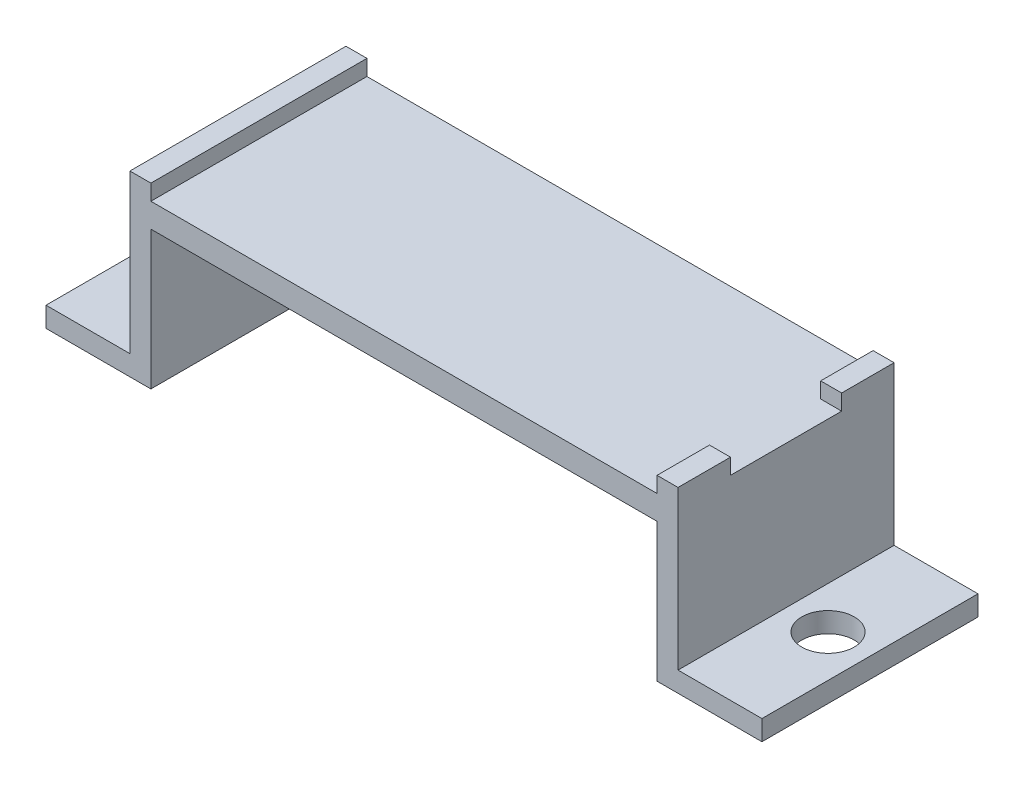
ISO-10303-21;
HEADER;
FILE_DESCRIPTION(('STEP AP214'),'2;1');
FILE_NAME('part.step','',(''),(''),'','','');
FILE_SCHEMA(('AUTOMOTIVE_DESIGN { 1 0 10303 214 1 1 1 1 }'));
ENDSEC;
DATA;
#1=APPLICATION_CONTEXT('core data for automotive mechanical design processes');
#2=APPLICATION_PROTOCOL_DEFINITION('international standard','automotive_design',2000,#1);
#3=PRODUCT_CONTEXT('',#1,'mechanical');
#4=PRODUCT('Part','Part','',(#3));
#5=PRODUCT_RELATED_PRODUCT_CATEGORY('part','',(#4));
#6=PRODUCT_DEFINITION_FORMATION('','',#4);
#7=PRODUCT_DEFINITION_CONTEXT('part definition',#1,'design');
#8=PRODUCT_DEFINITION('design','',#6,#7);
#9=PRODUCT_DEFINITION_SHAPE('','',#8);
#10=(LENGTH_UNIT() NAMED_UNIT(*) SI_UNIT(.MILLI.,.METRE.));
#11=(NAMED_UNIT(*) PLANE_ANGLE_UNIT() SI_UNIT($,.RADIAN.));
#12=(NAMED_UNIT(*) SI_UNIT($,.STERADIAN.) SOLID_ANGLE_UNIT());
#13=UNCERTAINTY_MEASURE_WITH_UNIT(LENGTH_MEASURE(1.E-05),#10,'distance_accuracy_value','');
#14=(GEOMETRIC_REPRESENTATION_CONTEXT(3) GLOBAL_UNCERTAINTY_ASSIGNED_CONTEXT((#13)) GLOBAL_UNIT_ASSIGNED_CONTEXT((#10,
#11,#12)) REPRESENTATION_CONTEXT('',''));
#15=CARTESIAN_POINT('',(0.,0.,0.));
#16=DIRECTION('',(0.,0.,1.));
#17=DIRECTION('',(1.,0.,0.));
#18=AXIS2_PLACEMENT_3D('',#15,#16,#17);
#19=CARTESIAN_POINT('',(35.3009167741011,-9.98205128205126,20.6));
#20=DIRECTION('',(0.,1.,0.));
#21=DIRECTION('',(-1.,0.,0.));
#22=AXIS2_PLACEMENT_3D('',#19,#20,#21);
#23=PLANE('',#22);
#24=CARTESIAN_POINT('',(-28.9590832258989,-9.98205128205127,10.3));
#25=DIRECTION('',(0.,1.,0.));
#26=DIRECTION('',(-1.,0.,0.));
#27=AXIS2_PLACEMENT_3D('',#24,#25,#26);
#28=CIRCLE('',#27,2.5);
#29=CARTESIAN_POINT('',(-31.4590832258989,-9.98205128205127,10.3));
#30=VERTEX_POINT('',#29);
#31=EDGE_CURVE('E211',#30,#30,#28,.T.);
#32=ORIENTED_EDGE('',*,*,#31,.T.);
#33=EDGE_LOOP('',(#32));
#34=FACE_BOUND('',#33,.T.);
#35=DIRECTION('',(1.,0.,0.));
#36=VECTOR('',#35,1.);
#37=CARTESIAN_POINT('',(35.3009167741011,-9.98205128205126,0.));
#38=LINE('',#37,#36);
#39=CARTESIAN_POINT('',(-32.9590832258989,-9.98205128205127,0.));
#40=VERTEX_POINT('',#39);
#41=CARTESIAN_POINT('',(-22.9590832258989,-9.98205128205128,0.));
#42=VERTEX_POINT('',#41);
#43=EDGE_CURVE('E351',#40,#42,#38,.T.);
#44=ORIENTED_EDGE('',*,*,#43,.T.);
#45=DIRECTION('',(0.,0.,1.));
#46=VECTOR('',#45,1.);
#47=CARTESIAN_POINT('',(-22.9590832258989,-9.98205128205128,-4.8));
#48=LINE('',#47,#46);
#49=CARTESIAN_POINT('',(-22.9590832258989,-9.98205128205128,20.6));
#50=VERTEX_POINT('',#49);
#51=EDGE_CURVE('E295',#42,#50,#48,.T.);
#52=ORIENTED_EDGE('',*,*,#51,.T.);
#53=DIRECTION('',(1.,0.,0.));
#54=VECTOR('',#53,1.);
#55=CARTESIAN_POINT('',(35.3009167741011,-9.98205128205126,20.6));
#56=LINE('',#55,#54);
#57=CARTESIAN_POINT('',(-32.9590832258989,-9.98205128205127,20.6));
#58=VERTEX_POINT('',#57);
#59=EDGE_CURVE('E326',#58,#50,#56,.T.);
#60=ORIENTED_EDGE('',*,*,#59,.F.);
#61=DIRECTION('',(0.,0.,-1.));
#62=VECTOR('',#61,1.);
#63=CARTESIAN_POINT('',(-32.9590832258989,-9.98205128205127,20.6));
#64=LINE('',#63,#62);
#65=EDGE_CURVE('E371',#58,#40,#64,.T.);
#66=ORIENTED_EDGE('',*,*,#65,.T.);
#67=EDGE_LOOP('',(#44,#52,#60,#66));
#68=FACE_BOUND('',#67,.T.);
#69=ADVANCED_FACE('F39',(#34,#68),#23,.F.);
#70=CARTESIAN_POINT('',(27.3009167741011,5.51794871794872,20.6));
#71=DIRECTION('',(-1.,0.,0.));
#72=DIRECTION('',(0.,-1.,0.));
#73=AXIS2_PLACEMENT_3D('',#70,#71,#72);
#74=PLANE('',#73);
#75=DIRECTION('',(0.,1.,0.));
#76=VECTOR('',#75,1.);
#77=CARTESIAN_POINT('',(27.3009167741011,5.51794871794872,0.));
#78=LINE('',#77,#76);
#79=CARTESIAN_POINT('',(27.3009167741011,-8.06410256410255,0.));
#80=VERTEX_POINT('',#79);
#81=CARTESIAN_POINT('',(27.3009167741011,7.01794871794873,0.));
#82=VERTEX_POINT('',#81);
#83=EDGE_CURVE('E299',#80,#82,#78,.T.);
#84=ORIENTED_EDGE('',*,*,#83,.T.);
#85=DIRECTION('',(0.,0.,1.));
#86=VECTOR('',#85,1.);
#87=CARTESIAN_POINT('',(27.3009167741011,7.01794871794873,0.));
#88=LINE('',#87,#86);
#89=CARTESIAN_POINT('',(27.3009167741011,7.01794871794873,5.));
#90=VERTEX_POINT('',#89);
#91=EDGE_CURVE('E183',#82,#90,#88,.T.);
#92=ORIENTED_EDGE('',*,*,#91,.T.);
#93=DIRECTION('',(0.,-1.,0.));
#94=VECTOR('',#93,1.);
#95=CARTESIAN_POINT('',(27.3009167741011,5.51794871794872,5.));
#96=LINE('',#95,#94);
#97=CARTESIAN_POINT('',(27.3009167741011,5.51794871794872,5.));
#98=VERTEX_POINT('',#97);
#99=EDGE_CURVE('E205',#90,#98,#96,.T.);
#100=ORIENTED_EDGE('',*,*,#99,.T.);
#101=DIRECTION('',(0.,0.,-1.));
#102=VECTOR('',#101,1.);
#103=CARTESIAN_POINT('',(27.3009167741011,5.51794871794872,20.6));
#104=LINE('',#103,#102);
#105=CARTESIAN_POINT('',(27.3009167741011,5.51794871794872,15.6));
#106=VERTEX_POINT('',#105);
#107=EDGE_CURVE('E60',#106,#98,#104,.T.);
#108=ORIENTED_EDGE('',*,*,#107,.F.);
#109=DIRECTION('',(0.,1.,0.));
#110=VECTOR('',#109,1.);
#111=CARTESIAN_POINT('',(27.3009167741011,5.51794871794872,15.6));
#112=LINE('',#111,#110);
#113=CARTESIAN_POINT('',(27.3009167741011,7.01794871794873,15.6));
#114=VERTEX_POINT('',#113);
#115=EDGE_CURVE('E222',#106,#114,#112,.T.);
#116=ORIENTED_EDGE('',*,*,#115,.T.);
#117=DIRECTION('',(0.,0.,1.));
#118=VECTOR('',#117,1.);
#119=CARTESIAN_POINT('',(27.3009167741011,7.01794871794873,20.6));
#120=LINE('',#119,#118);
#121=CARTESIAN_POINT('',(27.3009167741011,7.01794871794873,20.6));
#122=VERTEX_POINT('',#121);
#123=EDGE_CURVE('E229',#114,#122,#120,.T.);
#124=ORIENTED_EDGE('',*,*,#123,.T.);
#125=DIRECTION('',(0.,1.,0.));
#126=VECTOR('',#125,1.);
#127=CARTESIAN_POINT('',(27.3009167741011,5.51794871794872,20.6));
#128=LINE('',#127,#126);
#129=CARTESIAN_POINT('',(27.3009167741011,-8.06410256410255,20.6));
#130=VERTEX_POINT('',#129);
#131=EDGE_CURVE('E309',#130,#122,#128,.T.);
#132=ORIENTED_EDGE('',*,*,#131,.F.);
#133=DIRECTION('',(0.,0.,-1.));
#134=VECTOR('',#133,1.);
#135=CARTESIAN_POINT('',(27.3009167741011,-8.06410256410255,20.6));
#136=LINE('',#135,#134);
#137=EDGE_CURVE('E336',#130,#80,#136,.T.);
#138=ORIENTED_EDGE('',*,*,#137,.T.);
#139=EDGE_LOOP('',(#84,#92,#100,#108,#116,#124,#132,#138));
#140=FACE_BOUND('',#139,.T.);
#141=ADVANCED_FACE('F41',(#140),#74,.F.);
#142=CARTESIAN_POINT('',(-24.9590832258989,5.51794871794872,20.6));
#143=DIRECTION('',(0.,-1.,0.));
#144=DIRECTION('',(1.,0.,0.));
#145=AXIS2_PLACEMENT_3D('',#142,#143,#144);
#146=PLANE('',#145);
#147=ORIENTED_EDGE('',*,*,#107,.T.);
#148=DIRECTION('',(1.,0.,0.));
#149=VECTOR('',#148,1.);
#150=CARTESIAN_POINT('',(25.3009167741011,5.51794871794872,5.));
#151=LINE('',#150,#149);
#152=CARTESIAN_POINT('',(25.3009167741011,5.51794871794872,5.));
#153=VERTEX_POINT('',#152);
#154=EDGE_CURVE('E55',#153,#98,#151,.T.);
#155=ORIENTED_EDGE('',*,*,#154,.F.);
#156=DIRECTION('',(0.,0.,-1.));
#157=VECTOR('',#156,1.);
#158=CARTESIAN_POINT('',(25.3009167741011,5.51794871794872,0.));
#159=LINE('',#158,#157);
#160=CARTESIAN_POINT('',(25.3009167741011,5.51794871794872,0.));
#161=VERTEX_POINT('',#160);
#162=EDGE_CURVE('E189',#153,#161,#159,.T.);
#163=ORIENTED_EDGE('',*,*,#162,.T.);
#164=DIRECTION('',(-1.,0.,0.));
#165=VECTOR('',#164,1.);
#166=CARTESIAN_POINT('',(-24.9590832258989,5.51794871794872,0.));
#167=LINE('',#166,#165);
#168=CARTESIAN_POINT('',(-22.9590832258989,5.51794871794872,0.));
#169=VERTEX_POINT('',#168);
#170=EDGE_CURVE('E203',#161,#169,#167,.T.);
#171=ORIENTED_EDGE('',*,*,#170,.T.);
#172=DIRECTION('',(0.,0.,1.));
#173=VECTOR('',#172,1.);
#174=CARTESIAN_POINT('',(-22.9590832258989,5.51794871794872,0.));
#175=LINE('',#174,#173);
#176=CARTESIAN_POINT('',(-22.9590832258989,5.51794871794872,20.6));
#177=VERTEX_POINT('',#176);
#178=EDGE_CURVE('E261',#169,#177,#175,.T.);
#179=ORIENTED_EDGE('',*,*,#178,.T.);
#180=DIRECTION('',(-1.,0.,0.));
#181=VECTOR('',#180,1.);
#182=CARTESIAN_POINT('',(-24.9590832258989,5.51794871794872,20.6));
#183=LINE('',#182,#181);
#184=CARTESIAN_POINT('',(25.3009167741011,5.51794871794872,20.6));
#185=VERTEX_POINT('',#184);
#186=EDGE_CURVE('E312',#185,#177,#183,.T.);
#187=ORIENTED_EDGE('',*,*,#186,.F.);
#188=DIRECTION('',(0.,0.,-1.));
#189=VECTOR('',#188,1.);
#190=CARTESIAN_POINT('',(25.3009167741011,5.51794871794872,20.6));
#191=LINE('',#190,#189);
#192=CARTESIAN_POINT('',(25.3009167741011,5.51794871794872,15.6));
#193=VERTEX_POINT('',#192);
#194=EDGE_CURVE('E228',#185,#193,#191,.T.);
#195=ORIENTED_EDGE('',*,*,#194,.T.);
#196=DIRECTION('',(1.,0.,0.));
#197=VECTOR('',#196,1.);
#198=CARTESIAN_POINT('',(25.3009167741011,5.51794871794872,15.6));
#199=LINE('',#198,#197);
#200=EDGE_CURVE('E241',#193,#106,#199,.T.);
#201=ORIENTED_EDGE('',*,*,#200,.T.);
#202=EDGE_LOOP('',(#147,#155,#163,#171,#179,#187,#195,#201));
#203=FACE_BOUND('',#202,.T.);
#204=ADVANCED_FACE('F426',(#203),#146,.F.);
#205=CARTESIAN_POINT('',(-24.9590832258989,5.51794871794872,20.6));
#206=DIRECTION('',(1.,0.,0.));
#207=DIRECTION('',(0.,0.,-1.));
#208=AXIS2_PLACEMENT_3D('',#205,#206,#207);
#209=PLANE('',#208);
#210=DIRECTION('',(0.,-1.,0.));
#211=VECTOR('',#210,1.);
#212=CARTESIAN_POINT('',(-24.9590832258989,5.51794871794872,0.));
#213=LINE('',#212,#211);
#214=CARTESIAN_POINT('',(-24.9590832258989,7.01794871794872,0.));
#215=VERTEX_POINT('',#214);
#216=CARTESIAN_POINT('',(-24.9590832258989,-8.06410256410255,0.));
#217=VERTEX_POINT('',#216);
#218=EDGE_CURVE('E341',#215,#217,#213,.T.);
#219=ORIENTED_EDGE('',*,*,#218,.T.);
#220=DIRECTION('',(0.,0.,-1.));
#221=VECTOR('',#220,1.);
#222=CARTESIAN_POINT('',(-24.9590832258989,-8.06410256410255,20.6));
#223=LINE('',#222,#221);
#224=CARTESIAN_POINT('',(-24.9590832258989,-8.06410256410255,20.6));
#225=VERTEX_POINT('',#224);
#226=EDGE_CURVE('E379',#225,#217,#223,.T.);
#227=ORIENTED_EDGE('',*,*,#226,.F.);
#228=DIRECTION('',(0.,-1.,0.));
#229=VECTOR('',#228,1.);
#230=CARTESIAN_POINT('',(-24.9590832258989,5.51794871794872,20.6));
#231=LINE('',#230,#229);
#232=CARTESIAN_POINT('',(-24.9590832258989,7.01794871794872,20.6));
#233=VERTEX_POINT('',#232);
#234=EDGE_CURVE('E316',#233,#225,#231,.T.);
#235=ORIENTED_EDGE('',*,*,#234,.F.);
#236=DIRECTION('',(0.,0.,-1.));
#237=VECTOR('',#236,1.);
#238=CARTESIAN_POINT('',(-24.9590832258989,7.01794871794872,0.));
#239=LINE('',#238,#237);
#240=EDGE_CURVE('E252',#233,#215,#239,.T.);
#241=ORIENTED_EDGE('',*,*,#240,.T.);
#242=EDGE_LOOP('',(#219,#227,#235,#241));
#243=FACE_BOUND('',#242,.T.);
#244=ADVANCED_FACE('F415',(#243),#209,.F.);
#245=CARTESIAN_POINT('',(-32.9590832258989,-8.06410256410255,20.6));
#246=DIRECTION('',(0.,-1.,0.));
#247=DIRECTION('',(0.,0.,-1.));
#248=AXIS2_PLACEMENT_3D('',#245,#246,#247);
#249=PLANE('',#248);
#250=CARTESIAN_POINT('',(-28.9590832258989,-8.06410256410254,10.3));
#251=DIRECTION('',(0.,1.,0.));
#252=DIRECTION('',(-1.,0.,0.));
#253=AXIS2_PLACEMENT_3D('',#250,#251,#252);
#254=CIRCLE('',#253,2.5);
#255=CARTESIAN_POINT('',(-31.4590832258989,-8.06410256410254,10.3));
#256=VERTEX_POINT('',#255);
#257=EDGE_CURVE('E520',#256,#256,#254,.T.);
#258=ORIENTED_EDGE('',*,*,#257,.F.);
#259=EDGE_LOOP('',(#258));
#260=FACE_BOUND('',#259,.T.);
#261=DIRECTION('',(-1.,0.,0.));
#262=VECTOR('',#261,1.);
#263=CARTESIAN_POINT('',(-32.9590832258989,-8.06410256410255,0.));
#264=LINE('',#263,#262);
#265=CARTESIAN_POINT('',(-32.9590832258989,-8.06410256410255,0.));
#266=VERTEX_POINT('',#265);
#267=EDGE_CURVE('E344',#217,#266,#264,.T.);
#268=ORIENTED_EDGE('',*,*,#267,.T.);
#269=DIRECTION('',(0.,0.,-1.));
#270=VECTOR('',#269,1.);
#271=CARTESIAN_POINT('',(-32.9590832258989,-8.06410256410255,20.6));
#272=LINE('',#271,#270);
#273=CARTESIAN_POINT('',(-32.9590832258989,-8.06410256410255,20.6));
#274=VERTEX_POINT('',#273);
#275=EDGE_CURVE('E375',#274,#266,#272,.T.);
#276=ORIENTED_EDGE('',*,*,#275,.F.);
#277=DIRECTION('',(-1.,0.,0.));
#278=VECTOR('',#277,1.);
#279=CARTESIAN_POINT('',(-32.9590832258989,-8.06410256410255,20.6));
#280=LINE('',#279,#278);
#281=EDGE_CURVE('E319',#225,#274,#280,.T.);
#282=ORIENTED_EDGE('',*,*,#281,.F.);
#283=ORIENTED_EDGE('',*,*,#226,.T.);
#284=EDGE_LOOP('',(#268,#276,#282,#283));
#285=FACE_BOUND('',#284,.T.);
#286=ADVANCED_FACE('F412',(#260,#285),#249,.F.);
#287=CARTESIAN_POINT('',(-32.9590832258989,-9.98205128205127,20.6));
#288=DIRECTION('',(1.,0.,0.));
#289=DIRECTION('',(0.,0.,-1.));
#290=AXIS2_PLACEMENT_3D('',#287,#288,#289);
#291=PLANE('',#290);
#292=DIRECTION('',(0.,-1.,0.));
#293=VECTOR('',#292,1.);
#294=CARTESIAN_POINT('',(-32.9590832258989,-9.98205128205127,0.));
#295=LINE('',#294,#293);
#296=EDGE_CURVE('E347',#266,#40,#295,.T.);
#297=ORIENTED_EDGE('',*,*,#296,.T.);
#298=ORIENTED_EDGE('',*,*,#65,.F.);
#299=DIRECTION('',(0.,-1.,0.));
#300=VECTOR('',#299,1.);
#301=CARTESIAN_POINT('',(-32.9590832258989,-9.98205128205127,20.6));
#302=LINE('',#301,#300);
#303=EDGE_CURVE('E322',#274,#58,#302,.T.);
#304=ORIENTED_EDGE('',*,*,#303,.F.);
#305=ORIENTED_EDGE('',*,*,#275,.T.);
#306=EDGE_LOOP('',(#297,#298,#304,#305));
#307=FACE_BOUND('',#306,.T.);
#308=ADVANCED_FACE('F408',(#307),#291,.F.);
#309=CARTESIAN_POINT('',(31.3009167741011,-9.98205128205126,10.3));
#310=DIRECTION('',(0.,1.,0.));
#311=DIRECTION('',(-1.,0.,0.));
#312=AXIS2_PLACEMENT_3D('',#309,#310,#311);
#313=CIRCLE('',#312,2.5);
#314=CARTESIAN_POINT('',(28.8009167741011,-9.98205128205126,10.3));
#315=VERTEX_POINT('',#314);
#316=EDGE_CURVE('E471',#315,#315,#313,.T.);
#317=ORIENTED_EDGE('',*,*,#316,.T.);
#318=EDGE_LOOP('',(#317));
#319=FACE_BOUND('',#318,.T.);
#320=CARTESIAN_POINT('',(25.3009167741011,-9.98205128205128,20.6));
#321=VERTEX_POINT('',#320);
#322=CARTESIAN_POINT('',(35.3009167741011,-9.98205128205126,20.6));
#323=VERTEX_POINT('',#322);
#324=EDGE_CURVE('E325',#321,#323,#56,.T.);
#325=ORIENTED_EDGE('',*,*,#324,.F.);
#326=DIRECTION('',(0.,0.,1.));
#327=VECTOR('',#326,1.);
#328=CARTESIAN_POINT('',(25.3009167741011,-9.98205128205128,-4.8));
#329=LINE('',#328,#327);
#330=CARTESIAN_POINT('',(25.3009167741011,-9.98205128205128,0.));
#331=VERTEX_POINT('',#330);
#332=EDGE_CURVE('E303',#331,#321,#329,.T.);
#333=ORIENTED_EDGE('',*,*,#332,.F.);
#334=CARTESIAN_POINT('',(35.3009167741011,-9.98205128205126,0.));
#335=VERTEX_POINT('',#334);
#336=EDGE_CURVE('E350',#331,#335,#38,.T.);
#337=ORIENTED_EDGE('',*,*,#336,.T.);
#338=DIRECTION('',(0.,0.,-1.));
#339=VECTOR('',#338,1.);
#340=CARTESIAN_POINT('',(35.3009167741011,-9.98205128205126,20.6));
#341=LINE('',#340,#339);
#342=EDGE_CURVE('E367',#323,#335,#341,.T.);
#343=ORIENTED_EDGE('',*,*,#342,.F.);
#344=EDGE_LOOP('',(#325,#333,#337,#343));
#345=FACE_BOUND('',#344,.T.);
#346=ADVANCED_FACE('F452',(#319,#345),#23,.F.);
#347=CARTESIAN_POINT('',(35.3009167741011,-8.06410256410255,20.6));
#348=DIRECTION('',(-1.,0.,0.));
#349=DIRECTION('',(0.,0.,1.));
#350=AXIS2_PLACEMENT_3D('',#347,#348,#349);
#351=PLANE('',#350);
#352=DIRECTION('',(0.,1.,0.));
#353=VECTOR('',#352,1.);
#354=CARTESIAN_POINT('',(35.3009167741011,-8.06410256410255,0.));
#355=LINE('',#354,#353);
#356=CARTESIAN_POINT('',(35.3009167741011,-8.06410256410255,0.));
#357=VERTEX_POINT('',#356);
#358=EDGE_CURVE('E355',#335,#357,#355,.T.);
#359=ORIENTED_EDGE('',*,*,#358,.T.);
#360=DIRECTION('',(0.,0.,-1.));
#361=VECTOR('',#360,1.);
#362=CARTESIAN_POINT('',(35.3009167741011,-8.06410256410255,20.6));
#363=LINE('',#362,#361);
#364=CARTESIAN_POINT('',(35.3009167741011,-8.06410256410255,20.6));
#365=VERTEX_POINT('',#364);
#366=EDGE_CURVE('E363',#365,#357,#363,.T.);
#367=ORIENTED_EDGE('',*,*,#366,.F.);
#368=DIRECTION('',(0.,1.,0.));
#369=VECTOR('',#368,1.);
#370=CARTESIAN_POINT('',(35.3009167741011,-8.06410256410255,20.6));
#371=LINE('',#370,#369);
#372=EDGE_CURVE('E330',#323,#365,#371,.T.);
#373=ORIENTED_EDGE('',*,*,#372,.F.);
#374=ORIENTED_EDGE('',*,*,#342,.T.);
#375=EDGE_LOOP('',(#359,#367,#373,#374));
#376=FACE_BOUND('',#375,.T.);
#377=ADVANCED_FACE('F460',(#376),#351,.F.);
#378=CARTESIAN_POINT('',(27.3009167741011,-8.06410256410255,20.6));
#379=DIRECTION('',(0.,-1.,0.));
#380=DIRECTION('',(1.,0.,0.));
#381=AXIS2_PLACEMENT_3D('',#378,#379,#380);
#382=PLANE('',#381);
#383=CARTESIAN_POINT('',(31.3009167741011,-8.06410256410255,10.3));
#384=DIRECTION('',(0.,1.,0.));
#385=DIRECTION('',(-1.,0.,0.));
#386=AXIS2_PLACEMENT_3D('',#383,#384,#385);
#387=CIRCLE('',#386,2.5);
#388=CARTESIAN_POINT('',(28.8009167741011,-8.06410256410255,10.3));
#389=VERTEX_POINT('',#388);
#390=EDGE_CURVE('E517',#389,#389,#387,.T.);
#391=ORIENTED_EDGE('',*,*,#390,.F.);
#392=EDGE_LOOP('',(#391));
#393=FACE_BOUND('',#392,.T.);
#394=DIRECTION('',(-1.,0.,0.));
#395=VECTOR('',#394,1.);
#396=CARTESIAN_POINT('',(27.3009167741011,-8.06410256410255,0.));
#397=LINE('',#396,#395);
#398=EDGE_CURVE('E313',#357,#80,#397,.T.);
#399=ORIENTED_EDGE('',*,*,#398,.T.);
#400=ORIENTED_EDGE('',*,*,#137,.F.);
#401=DIRECTION('',(-1.,0.,0.));
#402=VECTOR('',#401,1.);
#403=CARTESIAN_POINT('',(27.3009167741011,-8.06410256410255,20.6));
#404=LINE('',#403,#402);
#405=EDGE_CURVE('E333',#365,#130,#404,.T.);
#406=ORIENTED_EDGE('',*,*,#405,.F.);
#407=ORIENTED_EDGE('',*,*,#366,.T.);
#408=EDGE_LOOP('',(#399,#400,#406,#407));
#409=FACE_BOUND('',#408,.T.);
#410=ADVANCED_FACE('F466',(#393,#409),#382,.F.);
#411=CARTESIAN_POINT('',(0.,0.,20.6));
#412=DIRECTION('',(0.,0.,1.));
#413=DIRECTION('',(1.,0.,0.));
#414=AXIS2_PLACEMENT_3D('',#411,#412,#413);
#415=PLANE('',#414);
#416=DIRECTION('',(0.,-1.,0.));
#417=VECTOR('',#416,1.);
#418=CARTESIAN_POINT('',(-22.9590832258989,-9.98205128205128,20.6));
#419=LINE('',#418,#417);
#420=CARTESIAN_POINT('',(-22.9590832258989,3.21794871794872,20.6));
#421=VERTEX_POINT('',#420);
#422=EDGE_CURVE('E281',#421,#50,#419,.T.);
#423=ORIENTED_EDGE('',*,*,#422,.F.);
#424=DIRECTION('',(-1.,0.,0.));
#425=VECTOR('',#424,1.);
#426=CARTESIAN_POINT('',(-22.9590832258989,3.21794871794872,20.6));
#427=LINE('',#426,#425);
#428=CARTESIAN_POINT('',(25.3009167741011,3.21794871794872,20.6));
#429=VERTEX_POINT('',#428);
#430=EDGE_CURVE('E291',#429,#421,#427,.T.);
#431=ORIENTED_EDGE('',*,*,#430,.F.);
#432=DIRECTION('',(0.,1.,0.));
#433=VECTOR('',#432,1.);
#434=CARTESIAN_POINT('',(25.3009167741011,-9.98205128205128,20.6));
#435=LINE('',#434,#433);
#436=EDGE_CURVE('E287',#321,#429,#435,.T.);
#437=ORIENTED_EDGE('',*,*,#436,.F.);
#438=ORIENTED_EDGE('',*,*,#324,.T.);
#439=ORIENTED_EDGE('',*,*,#372,.T.);
#440=ORIENTED_EDGE('',*,*,#405,.T.);
#441=ORIENTED_EDGE('',*,*,#131,.T.);
#442=DIRECTION('',(1.,0.,0.));
#443=VECTOR('',#442,1.);
#444=CARTESIAN_POINT('',(25.3009167741011,7.01794871794873,20.6));
#445=LINE('',#444,#443);
#446=CARTESIAN_POINT('',(25.3009167741011,7.01794871794873,20.6));
#447=VERTEX_POINT('',#446);
#448=EDGE_CURVE('E248',#447,#122,#445,.T.);
#449=ORIENTED_EDGE('',*,*,#448,.F.);
#450=DIRECTION('',(0.,-1.,0.));
#451=VECTOR('',#450,1.);
#452=CARTESIAN_POINT('',(25.3009167741011,5.51794871794872,20.6));
#453=LINE('',#452,#451);
#454=EDGE_CURVE('E225',#447,#185,#453,.T.);
#455=ORIENTED_EDGE('',*,*,#454,.T.);
#456=ORIENTED_EDGE('',*,*,#186,.T.);
#457=DIRECTION('',(0.,1.,0.));
#458=VECTOR('',#457,1.);
#459=CARTESIAN_POINT('',(-22.9590832258989,5.51794871794872,20.6));
#460=LINE('',#459,#458);
#461=CARTESIAN_POINT('',(-22.9590832258989,7.01794871794872,20.6));
#462=VERTEX_POINT('',#461);
#463=EDGE_CURVE('E265',#177,#462,#460,.T.);
#464=ORIENTED_EDGE('',*,*,#463,.T.);
#465=DIRECTION('',(-1.,0.,0.));
#466=VECTOR('',#465,1.);
#467=CARTESIAN_POINT('',(-22.9590832258989,7.01794871794872,20.6));
#468=LINE('',#467,#466);
#469=EDGE_CURVE('E273',#462,#233,#468,.T.);
#470=ORIENTED_EDGE('',*,*,#469,.T.);
#471=ORIENTED_EDGE('',*,*,#234,.T.);
#472=ORIENTED_EDGE('',*,*,#281,.T.);
#473=ORIENTED_EDGE('',*,*,#303,.T.);
#474=ORIENTED_EDGE('',*,*,#59,.T.);
#475=EDGE_LOOP('',(#423,#431,#437,#438,#439,#440,#441,#449,#455,#456,#464,#470,#471,#472,#473,#474));
#476=FACE_BOUND('',#475,.T.);
#477=ADVANCED_FACE('F402',(#476),#415,.T.);
#478=CARTESIAN_POINT('',(0.,0.,0.));
#479=DIRECTION('',(0.,0.,1.));
#480=DIRECTION('',(1.,0.,0.));
#481=AXIS2_PLACEMENT_3D('',#478,#479,#480);
#482=PLANE('',#481);
#483=DIRECTION('',(-1.,0.,0.));
#484=VECTOR('',#483,1.);
#485=CARTESIAN_POINT('',(0.,3.21794871794872,0.));
#486=LINE('',#485,#484);
#487=CARTESIAN_POINT('',(25.3009167741011,3.21794871794872,0.));
#488=VERTEX_POINT('',#487);
#489=CARTESIAN_POINT('',(-22.9590832258989,3.21794871794872,0.));
#490=VERTEX_POINT('',#489);
#491=EDGE_CURVE('E48',#488,#490,#486,.T.);
#492=ORIENTED_EDGE('',*,*,#491,.T.);
#493=DIRECTION('',(0.,-1.,0.));
#494=VECTOR('',#493,1.);
#495=CARTESIAN_POINT('',(-22.9590832258989,0.,0.));
#496=LINE('',#495,#494);
#497=EDGE_CURVE('E11',#490,#42,#496,.T.);
#498=ORIENTED_EDGE('',*,*,#497,.T.);
#499=ORIENTED_EDGE('',*,*,#43,.F.);
#500=ORIENTED_EDGE('',*,*,#296,.F.);
#501=ORIENTED_EDGE('',*,*,#267,.F.);
#502=ORIENTED_EDGE('',*,*,#218,.F.);
#503=DIRECTION('',(-1.,0.,0.));
#504=VECTOR('',#503,1.);
#505=CARTESIAN_POINT('',(-22.9590832258989,7.01794871794872,0.));
#506=LINE('',#505,#504);
#507=CARTESIAN_POINT('',(-22.9590832258989,7.01794871794872,0.));
#508=VERTEX_POINT('',#507);
#509=EDGE_CURVE('E277',#508,#215,#506,.T.);
#510=ORIENTED_EDGE('',*,*,#509,.F.);
#511=DIRECTION('',(0.,-1.,0.));
#512=VECTOR('',#511,1.);
#513=CARTESIAN_POINT('',(-22.9590832258989,5.51794871794872,0.));
#514=LINE('',#513,#512);
#515=EDGE_CURVE('E258',#508,#169,#514,.T.);
#516=ORIENTED_EDGE('',*,*,#515,.T.);
#517=ORIENTED_EDGE('',*,*,#170,.F.);
#518=DIRECTION('',(0.,1.,0.));
#519=VECTOR('',#518,1.);
#520=CARTESIAN_POINT('',(25.3009167741011,5.51794871794872,0.));
#521=LINE('',#520,#519);
#522=CARTESIAN_POINT('',(25.3009167741011,7.01794871794873,0.));
#523=VERTEX_POINT('',#522);
#524=EDGE_CURVE('E196',#161,#523,#521,.T.);
#525=ORIENTED_EDGE('',*,*,#524,.T.);
#526=DIRECTION('',(1.,0.,0.));
#527=VECTOR('',#526,1.);
#528=CARTESIAN_POINT('',(25.3009167741011,7.01794871794873,0.));
#529=LINE('',#528,#527);
#530=EDGE_CURVE('E178',#523,#82,#529,.T.);
#531=ORIENTED_EDGE('',*,*,#530,.T.);
#532=ORIENTED_EDGE('',*,*,#83,.F.);
#533=ORIENTED_EDGE('',*,*,#398,.F.);
#534=ORIENTED_EDGE('',*,*,#358,.F.);
#535=ORIENTED_EDGE('',*,*,#336,.F.);
#536=DIRECTION('',(0.,1.,0.));
#537=VECTOR('',#536,1.);
#538=CARTESIAN_POINT('',(25.3009167741011,0.,0.));
#539=LINE('',#538,#537);
#540=EDGE_CURVE('E385',#331,#488,#539,.T.);
#541=ORIENTED_EDGE('',*,*,#540,.T.);
#542=EDGE_LOOP('',(#492,#498,#499,#500,#501,#502,#510,#516,#517,#525,#531,#532,#533,#534,#535,#541));
#543=FACE_BOUND('',#542,.T.);
#544=ADVANCED_FACE('F201',(#543),#482,.F.);
#545=CARTESIAN_POINT('',(-22.9590832258989,-9.98205128205128,-4.8));
#546=DIRECTION('',(-1.,0.,0.));
#547=DIRECTION('',(0.,0.,1.));
#548=AXIS2_PLACEMENT_3D('',#545,#546,#547);
#549=PLANE('',#548);
#550=DIRECTION('',(0.,0.,1.));
#551=VECTOR('',#550,1.);
#552=CARTESIAN_POINT('',(-22.9590832258989,3.21794871794872,-4.8));
#553=LINE('',#552,#551);
#554=EDGE_CURVE('E296',#490,#421,#553,.T.);
#555=ORIENTED_EDGE('',*,*,#554,.T.);
#556=ORIENTED_EDGE('',*,*,#422,.T.);
#557=ORIENTED_EDGE('',*,*,#51,.F.);
#558=ORIENTED_EDGE('',*,*,#497,.F.);
#559=EDGE_LOOP('',(#555,#556,#557,#558));
#560=FACE_BOUND('',#559,.T.);
#561=ADVANCED_FACE('F398',(#560),#549,.F.);
#562=CARTESIAN_POINT('',(-22.9590832258989,3.21794871794872,-4.8));
#563=DIRECTION('',(0.,1.,0.));
#564=DIRECTION('',(0.,0.,1.));
#565=AXIS2_PLACEMENT_3D('',#562,#563,#564);
#566=PLANE('',#565);
#567=DIRECTION('',(0.,0.,1.));
#568=VECTOR('',#567,1.);
#569=CARTESIAN_POINT('',(25.3009167741011,3.21794871794872,-4.8));
#570=LINE('',#569,#568);
#571=EDGE_CURVE('E300',#488,#429,#570,.T.);
#572=ORIENTED_EDGE('',*,*,#571,.T.);
#573=ORIENTED_EDGE('',*,*,#430,.T.);
#574=ORIENTED_EDGE('',*,*,#554,.F.);
#575=ORIENTED_EDGE('',*,*,#491,.F.);
#576=EDGE_LOOP('',(#572,#573,#574,#575));
#577=FACE_BOUND('',#576,.T.);
#578=ADVANCED_FACE('F394',(#577),#566,.F.);
#579=CARTESIAN_POINT('',(25.3009167741011,-9.98205128205128,-4.8));
#580=DIRECTION('',(1.,0.,0.));
#581=DIRECTION('',(0.,0.,-1.));
#582=AXIS2_PLACEMENT_3D('',#579,#580,#581);
#583=PLANE('',#582);
#584=ORIENTED_EDGE('',*,*,#332,.T.);
#585=ORIENTED_EDGE('',*,*,#436,.T.);
#586=ORIENTED_EDGE('',*,*,#571,.F.);
#587=ORIENTED_EDGE('',*,*,#540,.F.);
#588=EDGE_LOOP('',(#584,#585,#586,#587));
#589=FACE_BOUND('',#588,.T.);
#590=ADVANCED_FACE('F499',(#589),#583,.F.);
#591=CARTESIAN_POINT('',(-22.9590832258989,7.01794871794872,0.));
#592=DIRECTION('',(0.,1.,0.));
#593=DIRECTION('',(0.,0.,1.));
#594=AXIS2_PLACEMENT_3D('',#591,#592,#593);
#595=PLANE('',#594);
#596=ORIENTED_EDGE('',*,*,#240,.F.);
#597=ORIENTED_EDGE('',*,*,#469,.F.);
#598=DIRECTION('',(0.,0.,-1.));
#599=VECTOR('',#598,1.);
#600=CARTESIAN_POINT('',(-22.9590832258989,7.01794871794872,0.));
#601=LINE('',#600,#599);
#602=EDGE_CURVE('E269',#462,#508,#601,.T.);
#603=ORIENTED_EDGE('',*,*,#602,.T.);
#604=ORIENTED_EDGE('',*,*,#509,.T.);
#605=EDGE_LOOP('',(#596,#597,#603,#604));
#606=FACE_BOUND('',#605,.T.);
#607=ADVANCED_FACE('F418',(#606),#595,.T.);
#608=CARTESIAN_POINT('',(-22.9590832258989,0.,0.));
#609=DIRECTION('',(1.,0.,0.));
#610=DIRECTION('',(0.,0.,-1.));
#611=AXIS2_PLACEMENT_3D('',#608,#609,#610);
#612=PLANE('',#611);
#613=ORIENTED_EDGE('',*,*,#515,.F.);
#614=ORIENTED_EDGE('',*,*,#602,.F.);
#615=ORIENTED_EDGE('',*,*,#463,.F.);
#616=ORIENTED_EDGE('',*,*,#178,.F.);
#617=EDGE_LOOP('',(#613,#614,#615,#616));
#618=FACE_BOUND('',#617,.T.);
#619=ADVANCED_FACE('F423',(#618),#612,.T.);
#620=CARTESIAN_POINT('',(25.3009167741011,7.01794871794873,20.6));
#621=DIRECTION('',(0.,1.,0.));
#622=DIRECTION('',(-1.,0.,0.));
#623=AXIS2_PLACEMENT_3D('',#620,#621,#622);
#624=PLANE('',#623);
#625=ORIENTED_EDGE('',*,*,#123,.F.);
#626=DIRECTION('',(1.,0.,0.));
#627=VECTOR('',#626,1.);
#628=CARTESIAN_POINT('',(25.3009167741011,7.01794871794873,15.6));
#629=LINE('',#628,#627);
#630=CARTESIAN_POINT('',(25.3009167741011,7.01794871794873,15.6));
#631=VERTEX_POINT('',#630);
#632=EDGE_CURVE('E253',#631,#114,#629,.T.);
#633=ORIENTED_EDGE('',*,*,#632,.F.);
#634=DIRECTION('',(0.,0.,1.));
#635=VECTOR('',#634,1.);
#636=CARTESIAN_POINT('',(25.3009167741011,7.01794871794873,20.6));
#637=LINE('',#636,#635);
#638=EDGE_CURVE('E237',#631,#447,#637,.T.);
#639=ORIENTED_EDGE('',*,*,#638,.T.);
#640=ORIENTED_EDGE('',*,*,#448,.T.);
#641=EDGE_LOOP('',(#625,#633,#639,#640));
#642=FACE_BOUND('',#641,.T.);
#643=ADVANCED_FACE('F487',(#642),#624,.T.);
#644=CARTESIAN_POINT('',(25.3009167741011,5.51794871794872,15.6));
#645=DIRECTION('',(0.,0.,-1.));
#646=DIRECTION('',(-1.,0.,0.));
#647=AXIS2_PLACEMENT_3D('',#644,#645,#646);
#648=PLANE('',#647);
#649=ORIENTED_EDGE('',*,*,#115,.F.);
#650=ORIENTED_EDGE('',*,*,#200,.F.);
#651=DIRECTION('',(0.,1.,0.));
#652=VECTOR('',#651,1.);
#653=CARTESIAN_POINT('',(25.3009167741011,5.51794871794872,15.6));
#654=LINE('',#653,#652);
#655=EDGE_CURVE('E233',#193,#631,#654,.T.);
#656=ORIENTED_EDGE('',*,*,#655,.T.);
#657=ORIENTED_EDGE('',*,*,#632,.T.);
#658=EDGE_LOOP('',(#649,#650,#656,#657));
#659=FACE_BOUND('',#658,.T.);
#660=ADVANCED_FACE('F434',(#659),#648,.T.);
#661=CARTESIAN_POINT('',(25.3009167741011,0.,0.));
#662=DIRECTION('',(-1.,0.,0.));
#663=DIRECTION('',(0.,-1.,0.));
#664=AXIS2_PLACEMENT_3D('',#661,#662,#663);
#665=PLANE('',#664);
#666=ORIENTED_EDGE('',*,*,#454,.F.);
#667=ORIENTED_EDGE('',*,*,#638,.F.);
#668=ORIENTED_EDGE('',*,*,#655,.F.);
#669=ORIENTED_EDGE('',*,*,#194,.F.);
#670=EDGE_LOOP('',(#666,#667,#668,#669));
#671=FACE_BOUND('',#670,.T.);
#672=ADVANCED_FACE('F432',(#671),#665,.T.);
#673=CARTESIAN_POINT('',(25.3009167741011,5.51794871794872,5.));
#674=DIRECTION('',(0.,0.,1.));
#675=DIRECTION('',(0.,-1.,0.));
#676=AXIS2_PLACEMENT_3D('',#673,#674,#675);
#677=PLANE('',#676);
#678=ORIENTED_EDGE('',*,*,#99,.F.);
#679=DIRECTION('',(1.,0.,0.));
#680=VECTOR('',#679,1.);
#681=CARTESIAN_POINT('',(25.3009167741011,7.01794871794873,5.));
#682=LINE('',#681,#680);
#683=CARTESIAN_POINT('',(25.3009167741011,7.01794871794873,5.));
#684=VERTEX_POINT('',#683);
#685=EDGE_CURVE('E188',#684,#90,#682,.T.);
#686=ORIENTED_EDGE('',*,*,#685,.F.);
#687=DIRECTION('',(0.,-1.,0.));
#688=VECTOR('',#687,1.);
#689=CARTESIAN_POINT('',(25.3009167741011,5.51794871794872,5.));
#690=LINE('',#689,#688);
#691=EDGE_CURVE('E197',#684,#153,#690,.T.);
#692=ORIENTED_EDGE('',*,*,#691,.T.);
#693=ORIENTED_EDGE('',*,*,#154,.T.);
#694=EDGE_LOOP('',(#678,#686,#692,#693));
#695=FACE_BOUND('',#694,.T.);
#696=ADVANCED_FACE('F439',(#695),#677,.T.);
#697=CARTESIAN_POINT('',(25.3009167741011,7.01794871794873,0.));
#698=DIRECTION('',(0.,1.,0.));
#699=DIRECTION('',(-1.,0.,0.));
#700=AXIS2_PLACEMENT_3D('',#697,#698,#699);
#701=PLANE('',#700);
#702=ORIENTED_EDGE('',*,*,#91,.F.);
#703=ORIENTED_EDGE('',*,*,#530,.F.);
#704=DIRECTION('',(0.,0.,1.));
#705=VECTOR('',#704,1.);
#706=CARTESIAN_POINT('',(25.3009167741011,7.01794871794873,0.));
#707=LINE('',#706,#705);
#708=EDGE_CURVE('E181',#523,#684,#707,.T.);
#709=ORIENTED_EDGE('',*,*,#708,.T.);
#710=ORIENTED_EDGE('',*,*,#685,.T.);
#711=EDGE_LOOP('',(#702,#703,#709,#710));
#712=FACE_BOUND('',#711,.T.);
#713=ADVANCED_FACE('F180',(#712),#701,.T.);
#714=CARTESIAN_POINT('',(25.3009167741011,0.,0.));
#715=DIRECTION('',(1.,0.,0.));
#716=DIRECTION('',(0.,1.,0.));
#717=AXIS2_PLACEMENT_3D('',#714,#715,#716);
#718=PLANE('',#717);
#719=ORIENTED_EDGE('',*,*,#524,.F.);
#720=ORIENTED_EDGE('',*,*,#162,.F.);
#721=ORIENTED_EDGE('',*,*,#691,.F.);
#722=ORIENTED_EDGE('',*,*,#708,.F.);
#723=EDGE_LOOP('',(#719,#720,#721,#722));
#724=FACE_BOUND('',#723,.T.);
#725=ADVANCED_FACE('F194',(#724),#718,.F.);
#726=CARTESIAN_POINT('',(31.3009167741011,-10.0641025641026,10.3));
#727=DIRECTION('',(0.,1.,0.));
#728=DIRECTION('',(-1.,0.,0.));
#729=AXIS2_PLACEMENT_3D('',#726,#727,#728);
#730=CYLINDRICAL_SURFACE('',#729,2.5);
#731=ORIENTED_EDGE('',*,*,#390,.T.);
#732=EDGE_LOOP('',(#731));
#733=FACE_BOUND('',#732,.T.);
#734=ORIENTED_EDGE('',*,*,#316,.F.);
#735=EDGE_LOOP('',(#734));
#736=FACE_BOUND('',#735,.T.);
#737=ADVANCED_FACE('F531',(#733,#736),#730,.F.);
#738=CARTESIAN_POINT('',(-28.9590832258989,-10.0641025641025,10.3));
#739=DIRECTION('',(0.,1.,0.));
#740=DIRECTION('',(-1.,0.,0.));
#741=AXIS2_PLACEMENT_3D('',#738,#739,#740);
#742=CYLINDRICAL_SURFACE('',#741,2.5);
#743=ORIENTED_EDGE('',*,*,#257,.T.);
#744=EDGE_LOOP('',(#743));
#745=FACE_BOUND('',#744,.T.);
#746=ORIENTED_EDGE('',*,*,#31,.F.);
#747=EDGE_LOOP('',(#746));
#748=FACE_BOUND('',#747,.T.);
#749=ADVANCED_FACE('F529',(#745,#748),#742,.F.);
#750=CLOSED_SHELL('',(#69,#141,#204,#244,#286,#308,#346,#377,#410,#477,#544,#561,#578,#590,#607,
#619,#643,#660,#672,#696,#713,#725,#737,#749));
#751=MANIFOLD_SOLID_BREP('B2',#750);
#752=ADVANCED_BREP_SHAPE_REPRESENTATION('',(#18,#751),#14);
#753=SHAPE_DEFINITION_REPRESENTATION(#9,#752);
ENDSEC;
END-ISO-10303-21;
